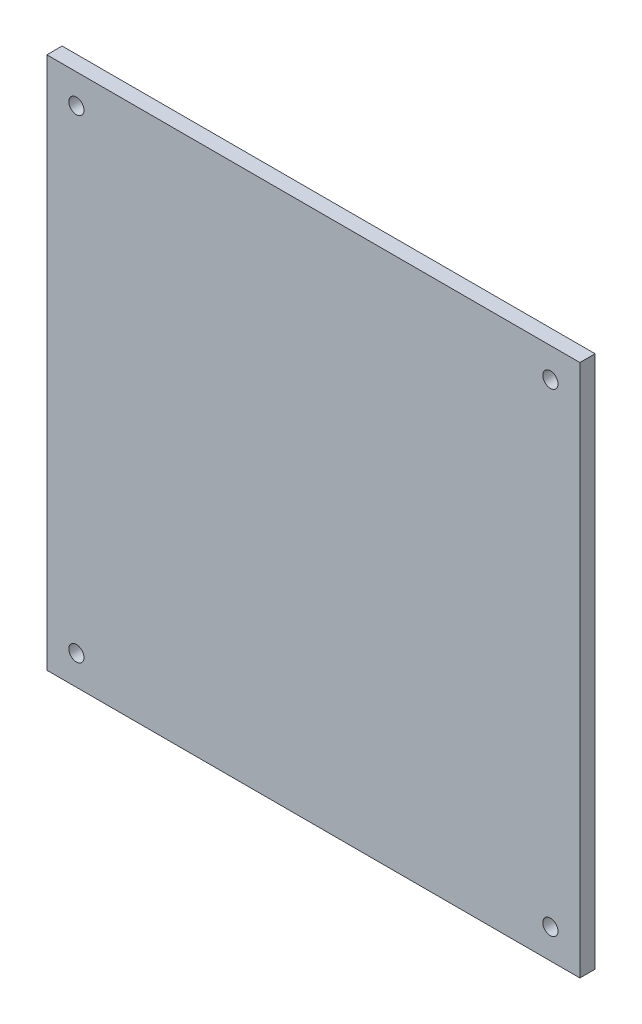
ISO-10303-21;
HEADER;
FILE_DESCRIPTION(('STEP AP214'),'2;1');
FILE_NAME('part.step','',(''),(''),'','','');
FILE_SCHEMA(('AUTOMOTIVE_DESIGN { 1 0 10303 214 1 1 1 1 }'));
ENDSEC;
DATA;
#1=APPLICATION_CONTEXT('core data for automotive mechanical design processes');
#2=APPLICATION_PROTOCOL_DEFINITION('international standard','automotive_design',2000,#1);
#3=PRODUCT_CONTEXT('',#1,'mechanical');
#4=PRODUCT('Part','Part','',(#3));
#5=PRODUCT_RELATED_PRODUCT_CATEGORY('part','',(#4));
#6=PRODUCT_DEFINITION_FORMATION('','',#4);
#7=PRODUCT_DEFINITION_CONTEXT('part definition',#1,'design');
#8=PRODUCT_DEFINITION('design','',#6,#7);
#9=PRODUCT_DEFINITION_SHAPE('','',#8);
#10=(LENGTH_UNIT() NAMED_UNIT(*) SI_UNIT(.MILLI.,.METRE.));
#11=(NAMED_UNIT(*) PLANE_ANGLE_UNIT() SI_UNIT($,.RADIAN.));
#12=(NAMED_UNIT(*) SI_UNIT($,.STERADIAN.) SOLID_ANGLE_UNIT());
#13=UNCERTAINTY_MEASURE_WITH_UNIT(LENGTH_MEASURE(1.E-05),#10,'distance_accuracy_value','');
#14=(GEOMETRIC_REPRESENTATION_CONTEXT(3) GLOBAL_UNCERTAINTY_ASSIGNED_CONTEXT((#13)) GLOBAL_UNIT_ASSIGNED_CONTEXT((#10,
#11,#12)) REPRESENTATION_CONTEXT('',''));
#15=CARTESIAN_POINT('',(0.,0.,0.));
#16=DIRECTION('',(0.,0.,1.));
#17=DIRECTION('',(1.,0.,0.));
#18=AXIS2_PLACEMENT_3D('',#15,#16,#17);
#19=CARTESIAN_POINT('',(65.8660521223309,-38.7716557372135,-4.));
#20=DIRECTION('',(-1.,0.,0.));
#21=DIRECTION('',(0.,0.,1.));
#22=AXIS2_PLACEMENT_3D('',#19,#20,#21);
#23=PLANE('',#22);
#24=DIRECTION('',(0.,-1.,0.));
#25=VECTOR('',#24,1.);
#26=CARTESIAN_POINT('',(65.8660521223309,-38.7716557372135,0.));
#27=LINE('',#26,#25);
#28=CARTESIAN_POINT('',(65.8660521223309,101.228344262787,0.));
#29=VERTEX_POINT('',#28);
#30=CARTESIAN_POINT('',(65.8660521223309,-38.7716557372135,0.));
#31=VERTEX_POINT('',#30);
#32=EDGE_CURVE('E107',#29,#31,#27,.T.);
#33=ORIENTED_EDGE('',*,*,#32,.F.);
#34=DIRECTION('',(0.,0.,1.));
#35=VECTOR('',#34,1.);
#36=CARTESIAN_POINT('',(65.8660521223309,101.228344262787,-4.));
#37=LINE('',#36,#35);
#38=CARTESIAN_POINT('',(65.8660521223309,101.228344262787,-4.));
#39=VERTEX_POINT('',#38);
#40=EDGE_CURVE('E11',#39,#29,#37,.T.);
#41=ORIENTED_EDGE('',*,*,#40,.F.);
#42=DIRECTION('',(0.,-1.,0.));
#43=VECTOR('',#42,1.);
#44=CARTESIAN_POINT('',(65.8660521223309,-38.7716557372135,-4.));
#45=LINE('',#44,#43);
#46=CARTESIAN_POINT('',(65.8660521223309,-38.7716557372135,-4.));
#47=VERTEX_POINT('',#46);
#48=EDGE_CURVE('E100',#39,#47,#45,.T.);
#49=ORIENTED_EDGE('',*,*,#48,.T.);
#50=DIRECTION('',(0.,0.,1.));
#51=VECTOR('',#50,1.);
#52=CARTESIAN_POINT('',(65.8660521223309,-38.7716557372135,-4.));
#53=LINE('',#52,#51);
#54=EDGE_CURVE('E45',#47,#31,#53,.T.);
#55=ORIENTED_EDGE('',*,*,#54,.T.);
#56=EDGE_LOOP('',(#33,#41,#49,#55));
#57=FACE_BOUND('',#56,.T.);
#58=ADVANCED_FACE('F42',(#57),#23,.T.);
#59=CARTESIAN_POINT('',(65.8660521223309,101.228344262787,-4.));
#60=DIRECTION('',(0.,1.,0.));
#61=DIRECTION('',(0.,0.,1.));
#62=AXIS2_PLACEMENT_3D('',#59,#60,#61);
#63=PLANE('',#62);
#64=DIRECTION('',(-1.,0.,0.));
#65=VECTOR('',#64,1.);
#66=CARTESIAN_POINT('',(65.8660521223309,101.228344262787,0.));
#67=LINE('',#66,#65);
#68=CARTESIAN_POINT('',(205.866052122331,101.228344262787,0.));
#69=VERTEX_POINT('',#68);
#70=EDGE_CURVE('E102',#69,#29,#67,.T.);
#71=ORIENTED_EDGE('',*,*,#70,.F.);
#72=DIRECTION('',(0.,0.,1.));
#73=VECTOR('',#72,1.);
#74=CARTESIAN_POINT('',(205.866052122331,101.228344262787,-4.));
#75=LINE('',#74,#73);
#76=CARTESIAN_POINT('',(205.866052122331,101.228344262787,-4.));
#77=VERTEX_POINT('',#76);
#78=EDGE_CURVE('E51',#77,#69,#75,.T.);
#79=ORIENTED_EDGE('',*,*,#78,.F.);
#80=DIRECTION('',(-1.,0.,0.));
#81=VECTOR('',#80,1.);
#82=CARTESIAN_POINT('',(65.8660521223309,101.228344262787,-4.));
#83=LINE('',#82,#81);
#84=EDGE_CURVE('E97',#77,#39,#83,.T.);
#85=ORIENTED_EDGE('',*,*,#84,.T.);
#86=ORIENTED_EDGE('',*,*,#40,.T.);
#87=EDGE_LOOP('',(#71,#79,#85,#86));
#88=FACE_BOUND('',#87,.T.);
#89=ADVANCED_FACE('F118',(#88),#63,.T.);
#90=CARTESIAN_POINT('',(205.866052122331,-38.7716557372135,-4.));
#91=DIRECTION('',(1.,0.,0.));
#92=DIRECTION('',(0.,0.,-1.));
#93=AXIS2_PLACEMENT_3D('',#90,#91,#92);
#94=PLANE('',#93);
#95=DIRECTION('',(0.,1.,0.));
#96=VECTOR('',#95,1.);
#97=CARTESIAN_POINT('',(205.866052122331,-38.7716557372135,0.));
#98=LINE('',#97,#96);
#99=CARTESIAN_POINT('',(205.866052122331,-38.7716557372135,0.));
#100=VERTEX_POINT('',#99);
#101=EDGE_CURVE('E92',#100,#69,#98,.T.);
#102=ORIENTED_EDGE('',*,*,#101,.F.);
#103=DIRECTION('',(0.,0.,1.));
#104=VECTOR('',#103,1.);
#105=CARTESIAN_POINT('',(205.866052122331,-38.7716557372135,-4.));
#106=LINE('',#105,#104);
#107=CARTESIAN_POINT('',(205.866052122331,-38.7716557372135,-4.));
#108=VERTEX_POINT('',#107);
#109=EDGE_CURVE('E87',#108,#100,#106,.T.);
#110=ORIENTED_EDGE('',*,*,#109,.F.);
#111=DIRECTION('',(0.,1.,0.));
#112=VECTOR('',#111,1.);
#113=CARTESIAN_POINT('',(205.866052122331,-38.7716557372135,-4.));
#114=LINE('',#113,#112);
#115=EDGE_CURVE('E90',#108,#77,#114,.T.);
#116=ORIENTED_EDGE('',*,*,#115,.T.);
#117=ORIENTED_EDGE('',*,*,#78,.T.);
#118=EDGE_LOOP('',(#102,#110,#116,#117));
#119=FACE_BOUND('',#118,.T.);
#120=ADVANCED_FACE('F89',(#119),#94,.T.);
#121=CARTESIAN_POINT('',(65.8660521223309,-38.7716557372135,-4.));
#122=DIRECTION('',(0.,-1.,0.));
#123=DIRECTION('',(0.,0.,-1.));
#124=AXIS2_PLACEMENT_3D('',#121,#122,#123);
#125=PLANE('',#124);
#126=DIRECTION('',(1.,0.,0.));
#127=VECTOR('',#126,1.);
#128=CARTESIAN_POINT('',(65.8660521223309,-38.7716557372135,0.));
#129=LINE('',#128,#127);
#130=EDGE_CURVE('E110',#31,#100,#129,.T.);
#131=ORIENTED_EDGE('',*,*,#130,.F.);
#132=ORIENTED_EDGE('',*,*,#54,.F.);
#133=DIRECTION('',(1.,0.,0.));
#134=VECTOR('',#133,1.);
#135=CARTESIAN_POINT('',(65.8660521223309,-38.7716557372135,-4.));
#136=LINE('',#135,#134);
#137=EDGE_CURVE('E96',#47,#108,#136,.T.);
#138=ORIENTED_EDGE('',*,*,#137,.T.);
#139=ORIENTED_EDGE('',*,*,#109,.T.);
#140=EDGE_LOOP('',(#131,#132,#138,#139));
#141=FACE_BOUND('',#140,.T.);
#142=ADVANCED_FACE('F99',(#141),#125,.T.);
#143=CARTESIAN_POINT('',(0.,0.,-4.));
#144=DIRECTION('',(0.,0.,-1.));
#145=DIRECTION('',(-1.,0.,0.));
#146=AXIS2_PLACEMENT_3D('',#143,#144,#145);
#147=PLANE('',#146);
#148=CARTESIAN_POINT('',(73.6160521223313,-31.0216557372135,-4.));
#149=DIRECTION('',(0.,0.,1.));
#150=DIRECTION('',(1.,0.,0.));
#151=AXIS2_PLACEMENT_3D('',#148,#149,#150);
#152=CIRCLE('',#151,2.);
#153=CARTESIAN_POINT('',(75.6160521223313,-31.0216557372135,-4.));
#154=VERTEX_POINT('',#153);
#155=EDGE_CURVE('E159',#154,#154,#152,.T.);
#156=ORIENTED_EDGE('',*,*,#155,.T.);
#157=EDGE_LOOP('',(#156));
#158=FACE_BOUND('',#157,.T.);
#159=CARTESIAN_POINT('',(198.116052122331,-31.0216557372135,-4.));
#160=DIRECTION('',(0.,0.,1.));
#161=DIRECTION('',(1.,0.,0.));
#162=AXIS2_PLACEMENT_3D('',#159,#160,#161);
#163=CIRCLE('',#162,2.);
#164=CARTESIAN_POINT('',(200.116052122331,-31.0216557372135,-4.));
#165=VERTEX_POINT('',#164);
#166=EDGE_CURVE('E167',#165,#165,#163,.T.);
#167=ORIENTED_EDGE('',*,*,#166,.T.);
#168=EDGE_LOOP('',(#167));
#169=FACE_BOUND('',#168,.T.);
#170=CARTESIAN_POINT('',(198.116052122331,93.4783442627865,-4.));
#171=DIRECTION('',(0.,0.,1.));
#172=DIRECTION('',(1.,0.,0.));
#173=AXIS2_PLACEMENT_3D('',#170,#171,#172);
#174=CIRCLE('',#173,2.);
#175=CARTESIAN_POINT('',(200.116052122331,93.4783442627865,-4.));
#176=VERTEX_POINT('',#175);
#177=EDGE_CURVE('E173',#176,#176,#174,.T.);
#178=ORIENTED_EDGE('',*,*,#177,.T.);
#179=EDGE_LOOP('',(#178));
#180=FACE_BOUND('',#179,.T.);
#181=CARTESIAN_POINT('',(73.6160521223309,93.4783442627865,-4.));
#182=DIRECTION('',(0.,0.,1.));
#183=DIRECTION('',(1.,0.,0.));
#184=AXIS2_PLACEMENT_3D('',#181,#182,#183);
#185=CIRCLE('',#184,2.);
#186=CARTESIAN_POINT('',(75.6160521223309,93.4783442627865,-4.));
#187=VERTEX_POINT('',#186);
#188=EDGE_CURVE('E111',#187,#187,#185,.T.);
#189=ORIENTED_EDGE('',*,*,#188,.T.);
#190=EDGE_LOOP('',(#189));
#191=FACE_BOUND('',#190,.T.);
#192=ORIENTED_EDGE('',*,*,#48,.F.);
#193=ORIENTED_EDGE('',*,*,#84,.F.);
#194=ORIENTED_EDGE('',*,*,#115,.F.);
#195=ORIENTED_EDGE('',*,*,#137,.F.);
#196=EDGE_LOOP('',(#192,#193,#194,#195));
#197=FACE_BOUND('',#196,.T.);
#198=ADVANCED_FACE('F95',(#158,#169,#180,#191,#197),#147,.T.);
#199=CARTESIAN_POINT('',(0.,0.,0.));
#200=DIRECTION('',(0.,0.,-1.));
#201=DIRECTION('',(-1.,0.,0.));
#202=AXIS2_PLACEMENT_3D('',#199,#200,#201);
#203=PLANE('',#202);
#204=CARTESIAN_POINT('',(73.6160521223313,-31.0216557372135,0.));
#205=DIRECTION('',(0.,0.,1.));
#206=DIRECTION('',(1.,0.,0.));
#207=AXIS2_PLACEMENT_3D('',#204,#205,#206);
#208=CIRCLE('',#207,2.);
#209=CARTESIAN_POINT('',(75.6160521223313,-31.0216557372135,0.));
#210=VERTEX_POINT('',#209);
#211=EDGE_CURVE('E162',#210,#210,#208,.T.);
#212=ORIENTED_EDGE('',*,*,#211,.F.);
#213=EDGE_LOOP('',(#212));
#214=FACE_BOUND('',#213,.T.);
#215=CARTESIAN_POINT('',(198.116052122331,-31.0216557372135,0.));
#216=DIRECTION('',(0.,0.,1.));
#217=DIRECTION('',(1.,0.,0.));
#218=AXIS2_PLACEMENT_3D('',#215,#216,#217);
#219=CIRCLE('',#218,2.);
#220=CARTESIAN_POINT('',(200.116052122331,-31.0216557372135,0.));
#221=VERTEX_POINT('',#220);
#222=EDGE_CURVE('E164',#221,#221,#219,.T.);
#223=ORIENTED_EDGE('',*,*,#222,.F.);
#224=EDGE_LOOP('',(#223));
#225=FACE_BOUND('',#224,.T.);
#226=CARTESIAN_POINT('',(198.116052122331,93.4783442627865,0.));
#227=DIRECTION('',(0.,0.,1.));
#228=DIRECTION('',(1.,0.,0.));
#229=AXIS2_PLACEMENT_3D('',#226,#227,#228);
#230=CIRCLE('',#229,2.);
#231=CARTESIAN_POINT('',(200.116052122331,93.4783442627865,0.));
#232=VERTEX_POINT('',#231);
#233=EDGE_CURVE('E170',#232,#232,#230,.T.);
#234=ORIENTED_EDGE('',*,*,#233,.F.);
#235=EDGE_LOOP('',(#234));
#236=FACE_BOUND('',#235,.T.);
#237=CARTESIAN_POINT('',(73.6160521223309,93.4783442627865,0.));
#238=DIRECTION('',(0.,0.,1.));
#239=DIRECTION('',(1.,0.,0.));
#240=AXIS2_PLACEMENT_3D('',#237,#238,#239);
#241=CIRCLE('',#240,2.);
#242=CARTESIAN_POINT('',(75.6160521223309,93.4783442627865,0.));
#243=VERTEX_POINT('',#242);
#244=EDGE_CURVE('E176',#243,#243,#241,.T.);
#245=ORIENTED_EDGE('',*,*,#244,.F.);
#246=EDGE_LOOP('',(#245));
#247=FACE_BOUND('',#246,.T.);
#248=ORIENTED_EDGE('',*,*,#32,.T.);
#249=ORIENTED_EDGE('',*,*,#130,.T.);
#250=ORIENTED_EDGE('',*,*,#101,.T.);
#251=ORIENTED_EDGE('',*,*,#70,.T.);
#252=EDGE_LOOP('',(#248,#249,#250,#251));
#253=FACE_BOUND('',#252,.T.);
#254=ADVANCED_FACE('F117',(#214,#225,#236,#247,#253),#203,.F.);
#255=CARTESIAN_POINT('',(73.6160521223309,93.4783442627865,-4.));
#256=DIRECTION('',(0.,0.,1.));
#257=DIRECTION('',(1.,0.,0.));
#258=AXIS2_PLACEMENT_3D('',#255,#256,#257);
#259=CYLINDRICAL_SURFACE('',#258,2.);
#260=ORIENTED_EDGE('',*,*,#188,.F.);
#261=EDGE_LOOP('',(#260));
#262=FACE_BOUND('',#261,.T.);
#263=ORIENTED_EDGE('',*,*,#244,.T.);
#264=EDGE_LOOP('',(#263));
#265=FACE_BOUND('',#264,.T.);
#266=ADVANCED_FACE('F136',(#262,#265),#259,.F.);
#267=CARTESIAN_POINT('',(198.116052122331,93.4783442627865,-4.));
#268=DIRECTION('',(0.,0.,1.));
#269=DIRECTION('',(1.,0.,0.));
#270=AXIS2_PLACEMENT_3D('',#267,#268,#269);
#271=CYLINDRICAL_SURFACE('',#270,2.);
#272=ORIENTED_EDGE('',*,*,#177,.F.);
#273=EDGE_LOOP('',(#272));
#274=FACE_BOUND('',#273,.T.);
#275=ORIENTED_EDGE('',*,*,#233,.T.);
#276=EDGE_LOOP('',(#275));
#277=FACE_BOUND('',#276,.T.);
#278=ADVANCED_FACE('F143',(#274,#277),#271,.F.);
#279=CARTESIAN_POINT('',(198.116052122331,-31.0216557372135,-4.));
#280=DIRECTION('',(0.,0.,1.));
#281=DIRECTION('',(1.,0.,0.));
#282=AXIS2_PLACEMENT_3D('',#279,#280,#281);
#283=CYLINDRICAL_SURFACE('',#282,2.);
#284=ORIENTED_EDGE('',*,*,#166,.F.);
#285=EDGE_LOOP('',(#284));
#286=FACE_BOUND('',#285,.T.);
#287=ORIENTED_EDGE('',*,*,#222,.T.);
#288=EDGE_LOOP('',(#287));
#289=FACE_BOUND('',#288,.T.);
#290=ADVANCED_FACE('F147',(#286,#289),#283,.F.);
#291=CARTESIAN_POINT('',(73.6160521223313,-31.0216557372135,-4.));
#292=DIRECTION('',(0.,0.,1.));
#293=DIRECTION('',(1.,0.,0.));
#294=AXIS2_PLACEMENT_3D('',#291,#292,#293);
#295=CYLINDRICAL_SURFACE('',#294,2.);
#296=ORIENTED_EDGE('',*,*,#155,.F.);
#297=EDGE_LOOP('',(#296));
#298=FACE_BOUND('',#297,.T.);
#299=ORIENTED_EDGE('',*,*,#211,.T.);
#300=EDGE_LOOP('',(#299));
#301=FACE_BOUND('',#300,.T.);
#302=ADVANCED_FACE('F151',(#298,#301),#295,.F.);
#303=CLOSED_SHELL('',(#58,#89,#120,#142,#198,#254,#266,#278,#290,#302));
#304=MANIFOLD_SOLID_BREP('B2',#303);
#305=ADVANCED_BREP_SHAPE_REPRESENTATION('',(#18,#304),#14);
#306=SHAPE_DEFINITION_REPRESENTATION(#9,#305);
ENDSEC;
END-ISO-10303-21;
